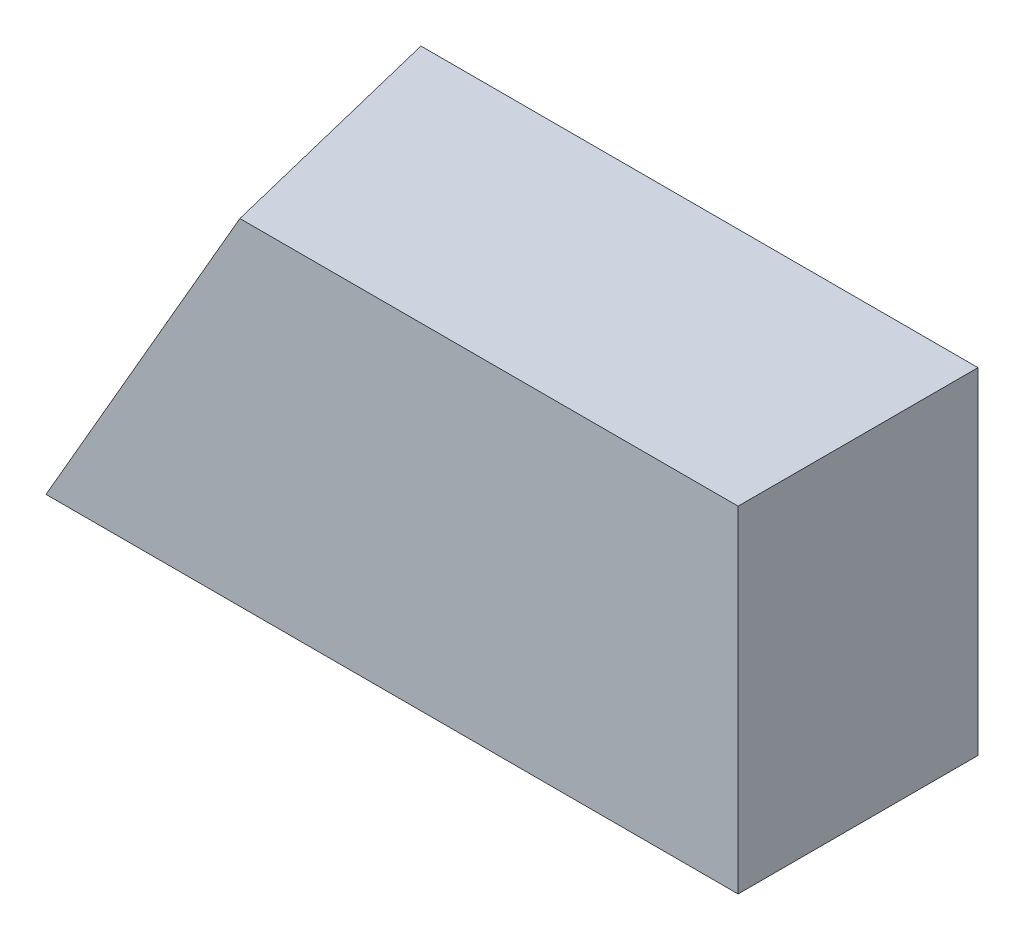
ISO-10303-21;
HEADER;
FILE_DESCRIPTION(('STEP AP214'),'2;1');
FILE_NAME('part.step','',(''),(''),'','','');
FILE_SCHEMA(('AUTOMOTIVE_DESIGN { 1 0 10303 214 1 1 1 1 }'));
ENDSEC;
DATA;
#1=APPLICATION_CONTEXT('core data for automotive mechanical design processes');
#2=APPLICATION_PROTOCOL_DEFINITION('international standard','automotive_design',2000,#1);
#3=PRODUCT_CONTEXT('',#1,'mechanical');
#4=PRODUCT('Part','Part','',(#3));
#5=PRODUCT_RELATED_PRODUCT_CATEGORY('part','',(#4));
#6=PRODUCT_DEFINITION_FORMATION('','',#4);
#7=PRODUCT_DEFINITION_CONTEXT('part definition',#1,'design');
#8=PRODUCT_DEFINITION('design','',#6,#7);
#9=PRODUCT_DEFINITION_SHAPE('','',#8);
#10=(LENGTH_UNIT() NAMED_UNIT(*) SI_UNIT(.MILLI.,.METRE.));
#11=(NAMED_UNIT(*) PLANE_ANGLE_UNIT() SI_UNIT($,.RADIAN.));
#12=(NAMED_UNIT(*) SI_UNIT($,.STERADIAN.) SOLID_ANGLE_UNIT());
#13=UNCERTAINTY_MEASURE_WITH_UNIT(LENGTH_MEASURE(1.E-05),#10,'distance_accuracy_value','');
#14=(GEOMETRIC_REPRESENTATION_CONTEXT(3) GLOBAL_UNCERTAINTY_ASSIGNED_CONTEXT((#13)) GLOBAL_UNIT_ASSIGNED_CONTEXT((#10,
#11,#12)) REPRESENTATION_CONTEXT('',''));
#15=CARTESIAN_POINT('',(0.,0.,0.));
#16=DIRECTION('',(0.,0.,1.));
#17=DIRECTION('',(1.,0.,0.));
#18=AXIS2_PLACEMENT_3D('',#15,#16,#17);
#19=CARTESIAN_POINT('',(0.,0.,0.));
#20=DIRECTION('',(0.,-1.,0.));
#21=DIRECTION('',(0.,0.,-1.));
#22=AXIS2_PLACEMENT_3D('',#19,#20,#21);
#23=PLANE('',#22);
#24=DIRECTION('',(0.,0.,-1.));
#25=VECTOR('',#24,1.);
#26=CARTESIAN_POINT('',(121.3866,0.,0.));
#27=LINE('',#26,#25);
#28=CARTESIAN_POINT('',(121.3866,0.,-6.74370000000002));
#29=VERTEX_POINT('',#28);
#30=CARTESIAN_POINT('',(121.3866,0.,-26.9748000000001));
#31=VERTEX_POINT('',#30);
#32=EDGE_CURVE('E180',#29,#31,#27,.T.);
#33=ORIENTED_EDGE('',*,*,#32,.T.);
#34=DIRECTION('',(-1.,0.,0.));
#35=VECTOR('',#34,1.);
#36=CARTESIAN_POINT('',(0.,0.,-26.9748));
#37=LINE('',#36,#35);
#38=CARTESIAN_POINT('',(74.7807055054085,0.,-26.9748000000001));
#39=VERTEX_POINT('',#38);
#40=EDGE_CURVE('E175',#31,#39,#37,.T.);
#41=ORIENTED_EDGE('',*,*,#40,.T.);
#42=DIRECTION('',(0.,0.,-1.));
#43=VECTOR('',#42,1.);
#44=CARTESIAN_POINT('',(74.7807055054085,0.,0.));
#45=LINE('',#44,#43);
#46=CARTESIAN_POINT('',(74.7807055054085,0.,-6.74370000000002));
#47=VERTEX_POINT('',#46);
#48=EDGE_CURVE('E163',#47,#39,#45,.T.);
#49=ORIENTED_EDGE('',*,*,#48,.F.);
#50=DIRECTION('',(1.,0.,0.));
#51=VECTOR('',#50,1.);
#52=CARTESIAN_POINT('',(0.,0.,-6.7437));
#53=LINE('',#52,#51);
#54=EDGE_CURVE('E171',#47,#29,#53,.T.);
#55=ORIENTED_EDGE('',*,*,#54,.T.);
#56=EDGE_LOOP('',(#33,#41,#49,#55));
#57=FACE_BOUND('',#56,.T.);
#58=DIRECTION('',(1.,0.,0.));
#59=VECTOR('',#58,1.);
#60=CARTESIAN_POINT('',(0.,0.,0.));
#61=LINE('',#60,#59);
#62=CARTESIAN_POINT('',(35.4031731808797,0.,0.));
#63=VERTEX_POINT('',#62);
#64=CARTESIAN_POINT('',(127.,0.,0.));
#65=VERTEX_POINT('',#64);
#66=EDGE_CURVE('E35',#63,#65,#61,.T.);
#67=ORIENTED_EDGE('',*,*,#66,.F.);
#68=DIRECTION('',(-0.238364575010059,0.,-0.971175745877271));
#69=VECTOR('',#68,1.);
#70=CARTESIAN_POINT('',(33.3916473481953,0.,-8.19561841698234));
#71=LINE('',#70,#69);
#72=CARTESIAN_POINT('',(27.6104793366434,0.,-31.75));
#73=VERTEX_POINT('',#72);
#74=EDGE_CURVE('E49',#63,#73,#71,.T.);
#75=ORIENTED_EDGE('',*,*,#74,.T.);
#76=DIRECTION('',(-1.,0.,0.));
#77=VECTOR('',#76,1.);
#78=CARTESIAN_POINT('',(0.,0.,-31.75));
#79=LINE('',#78,#77);
#80=CARTESIAN_POINT('',(127.,0.,-31.75));
#81=VERTEX_POINT('',#80);
#82=EDGE_CURVE('E117',#81,#73,#79,.T.);
#83=ORIENTED_EDGE('',*,*,#82,.F.);
#84=DIRECTION('',(0.,0.,-1.));
#85=VECTOR('',#84,1.);
#86=CARTESIAN_POINT('',(127.,0.,0.));
#87=LINE('',#86,#85);
#88=EDGE_CURVE('E122',#65,#81,#87,.T.);
#89=ORIENTED_EDGE('',*,*,#88,.F.);
#90=EDGE_LOOP('',(#67,#75,#83,#89));
#91=FACE_BOUND('',#90,.T.);
#92=ADVANCED_FACE('F32',(#57,#91),#23,.T.);
#93=CARTESIAN_POINT('',(0.,44.45,0.));
#94=DIRECTION('',(0.,0.,-1.));
#95=DIRECTION('',(-1.,0.,0.));
#96=AXIS2_PLACEMENT_3D('',#93,#94,#95);
#97=PLANE('',#96);
#98=DIRECTION('',(0.500000000000002,0.866025403784438,0.));
#99=VECTOR('',#98,1.);
#100=CARTESIAN_POINT('',(45.7997944847689,18.007476325389,0.));
#101=LINE('',#100,#99);
#102=CARTESIAN_POINT('',(61.0663926463587,44.45,0.));
#103=VERTEX_POINT('',#102);
#104=EDGE_CURVE('E102',#63,#103,#101,.T.);
#105=ORIENTED_EDGE('',*,*,#104,.F.);
#106=ORIENTED_EDGE('',*,*,#66,.T.);
#107=DIRECTION('',(0.,-1.,0.));
#108=VECTOR('',#107,1.);
#109=CARTESIAN_POINT('',(127.,44.45,0.));
#110=LINE('',#109,#108);
#111=CARTESIAN_POINT('',(127.,44.45,0.));
#112=VERTEX_POINT('',#111);
#113=EDGE_CURVE('E124',#112,#65,#110,.T.);
#114=ORIENTED_EDGE('',*,*,#113,.F.);
#115=DIRECTION('',(1.,0.,0.));
#116=VECTOR('',#115,1.);
#117=CARTESIAN_POINT('',(0.,44.45,0.));
#118=LINE('',#117,#116);
#119=EDGE_CURVE('E126',#103,#112,#118,.T.);
#120=ORIENTED_EDGE('',*,*,#119,.F.);
#121=EDGE_LOOP('',(#105,#106,#114,#120));
#122=FACE_BOUND('',#121,.T.);
#123=ADVANCED_FACE('F221',(#122),#97,.F.);
#124=CARTESIAN_POINT('',(0.,44.45,-31.75));
#125=DIRECTION('',(0.,0.,1.));
#126=DIRECTION('',(1.,0.,0.));
#127=AXIS2_PLACEMENT_3D('',#124,#125,#126);
#128=PLANE('',#127);
#129=DIRECTION('',(-0.500000000000002,-0.866025403784438,0.));
#130=VECTOR('',#129,1.);
#131=CARTESIAN_POINT('',(39.9552741015917,21.3818117419006,-31.75));
#132=LINE('',#131,#130);
#133=CARTESIAN_POINT('',(53.2736988021224,44.45,-31.75));
#134=VERTEX_POINT('',#133);
#135=EDGE_CURVE('E11',#134,#73,#132,.T.);
#136=ORIENTED_EDGE('',*,*,#135,.F.);
#137=DIRECTION('',(-1.,0.,0.));
#138=VECTOR('',#137,1.);
#139=CARTESIAN_POINT('',(0.,44.45,-31.75));
#140=LINE('',#139,#138);
#141=CARTESIAN_POINT('',(127.,44.45,-31.75));
#142=VERTEX_POINT('',#141);
#143=EDGE_CURVE('E115',#142,#134,#140,.T.);
#144=ORIENTED_EDGE('',*,*,#143,.F.);
#145=DIRECTION('',(0.,-1.,0.));
#146=VECTOR('',#145,1.);
#147=CARTESIAN_POINT('',(127.,44.45,-31.75));
#148=LINE('',#147,#146);
#149=EDGE_CURVE('E130',#142,#81,#148,.T.);
#150=ORIENTED_EDGE('',*,*,#149,.T.);
#151=ORIENTED_EDGE('',*,*,#82,.T.);
#152=EDGE_LOOP('',(#136,#144,#150,#151));
#153=FACE_BOUND('',#152,.T.);
#154=ADVANCED_FACE('F113',(#153),#128,.F.);
#155=CARTESIAN_POINT('',(0.,44.45,0.));
#156=DIRECTION('',(0.,-1.,0.));
#157=DIRECTION('',(0.,0.,-1.));
#158=AXIS2_PLACEMENT_3D('',#155,#156,#157);
#159=PLANE('',#158);
#160=DIRECTION('',(-0.238364575010059,0.,-0.971175745877271));
#161=VECTOR('',#160,1.);
#162=CARTESIAN_POINT('',(57.596742463043,44.45,-14.1364970217265));
#163=LINE('',#162,#161);
#164=EDGE_CURVE('E41',#103,#134,#163,.T.);
#165=ORIENTED_EDGE('',*,*,#164,.F.);
#166=ORIENTED_EDGE('',*,*,#119,.T.);
#167=DIRECTION('',(0.,0.,-1.));
#168=VECTOR('',#167,1.);
#169=CARTESIAN_POINT('',(127.,44.45,0.));
#170=LINE('',#169,#168);
#171=EDGE_CURVE('E120',#112,#142,#170,.T.);
#172=ORIENTED_EDGE('',*,*,#171,.T.);
#173=ORIENTED_EDGE('',*,*,#143,.T.);
#174=EDGE_LOOP('',(#165,#166,#172,#173));
#175=FACE_BOUND('',#174,.T.);
#176=ADVANCED_FACE('F118',(#175),#159,.F.);
#177=CARTESIAN_POINT('',(127.,44.45,0.));
#178=DIRECTION('',(-1.,0.,0.));
#179=DIRECTION('',(0.,0.,1.));
#180=AXIS2_PLACEMENT_3D('',#177,#178,#179);
#181=PLANE('',#180);
#182=ORIENTED_EDGE('',*,*,#88,.T.);
#183=ORIENTED_EDGE('',*,*,#149,.F.);
#184=ORIENTED_EDGE('',*,*,#171,.F.);
#185=ORIENTED_EDGE('',*,*,#113,.T.);
#186=EDGE_LOOP('',(#182,#183,#184,#185));
#187=FACE_BOUND('',#186,.T.);
#188=ADVANCED_FACE('F232',(#187),#181,.F.);
#189=CARTESIAN_POINT('',(121.3866,40.4622,157.553779196041));
#190=DIRECTION('',(-1.,0.,0.));
#191=DIRECTION('',(0.,0.,1.));
#192=AXIS2_PLACEMENT_3D('',#189,#190,#191);
#193=PLANE('',#192);
#194=DIRECTION('',(0.,-1.,0.));
#195=VECTOR('',#194,1.);
#196=CARTESIAN_POINT('',(121.3866,40.4622,-6.74370000000002));
#197=LINE('',#196,#195);
#198=CARTESIAN_POINT('',(121.3866,35.06724,-6.74370000000002));
#199=VERTEX_POINT('',#198);
#200=EDGE_CURVE('E161',#199,#29,#197,.T.);
#201=ORIENTED_EDGE('',*,*,#200,.F.);
#202=DIRECTION('',(0.,0.,-1.));
#203=VECTOR('',#202,1.);
#204=CARTESIAN_POINT('',(121.3866,35.06724,36.1671791960408));
#205=LINE('',#204,#203);
#206=CARTESIAN_POINT('',(121.3866,35.06724,-26.9748000000001));
#207=VERTEX_POINT('',#206);
#208=EDGE_CURVE('E149',#207,#199,#205,.F.);
#209=ORIENTED_EDGE('',*,*,#208,.F.);
#210=DIRECTION('',(0.,1.,0.));
#211=VECTOR('',#210,1.);
#212=CARTESIAN_POINT('',(121.3866,40.4622,-26.9748000000001));
#213=LINE('',#212,#211);
#214=EDGE_CURVE('E138',#31,#207,#213,.T.);
#215=ORIENTED_EDGE('',*,*,#214,.F.);
#216=ORIENTED_EDGE('',*,*,#32,.F.);
#217=EDGE_LOOP('',(#201,#209,#215,#216));
#218=FACE_BOUND('',#217,.T.);
#219=ADVANCED_FACE('F187',(#218),#193,.T.);
#220=CARTESIAN_POINT('',(121.3866,40.4622,157.553779196041));
#221=DIRECTION('',(0.,1.,0.));
#222=DIRECTION('',(0.,0.,1.));
#223=AXIS2_PLACEMENT_3D('',#220,#221,#222);
#224=PLANE('',#223);
#225=DIRECTION('',(-1.,0.,0.));
#226=VECTOR('',#225,1.);
#227=CARTESIAN_POINT('',(138.920219997163,40.4622,-6.74370000000002));
#228=LINE('',#227,#226);
#229=CARTESIAN_POINT('',(115.99164,40.4622,-6.74370000000002));
#230=VERTEX_POINT('',#229);
#231=CARTESIAN_POINT('',(99.80676,40.4622,-6.74370000000002));
#232=VERTEX_POINT('',#231);
#233=EDGE_CURVE('E157',#230,#232,#228,.T.);
#234=ORIENTED_EDGE('',*,*,#233,.T.);
#235=DIRECTION('',(0.,0.,1.));
#236=VECTOR('',#235,1.);
#237=CARTESIAN_POINT('',(99.80676,40.4622,157.553779196041));
#238=LINE('',#237,#236);
#239=CARTESIAN_POINT('',(99.80676,40.4622,-26.9748000000001));
#240=VERTEX_POINT('',#239);
#241=EDGE_CURVE('E140',#240,#232,#238,.T.);
#242=ORIENTED_EDGE('',*,*,#241,.F.);
#243=DIRECTION('',(1.,0.,0.));
#244=VECTOR('',#243,1.);
#245=CARTESIAN_POINT('',(121.3866,40.4622,-26.9748000000001));
#246=LINE('',#245,#244);
#247=CARTESIAN_POINT('',(115.99164,40.4622,-26.9748000000001));
#248=VERTEX_POINT('',#247);
#249=EDGE_CURVE('E154',#240,#248,#246,.T.);
#250=ORIENTED_EDGE('',*,*,#249,.T.);
#251=DIRECTION('',(0.,0.,-1.));
#252=VECTOR('',#251,1.);
#253=CARTESIAN_POINT('',(115.99164,40.4622,-58.2446208039592));
#254=LINE('',#253,#252);
#255=EDGE_CURVE('E145',#230,#248,#254,.T.);
#256=ORIENTED_EDGE('',*,*,#255,.F.);
#257=EDGE_LOOP('',(#234,#242,#250,#256));
#258=FACE_BOUND('',#257,.T.);
#259=ADVANCED_FACE('F201',(#258),#224,.F.);
#260=CARTESIAN_POINT('',(115.99164,35.06724,157.553779196041));
#261=DIRECTION('',(0.,0.,1.));
#262=DIRECTION('',(1.,0.,0.));
#263=AXIS2_PLACEMENT_3D('',#260,#261,#262);
#264=CYLINDRICAL_SURFACE('',#263,5.39496);
#265=CARTESIAN_POINT('',(115.99164,35.06724,-6.74370000000002));
#266=DIRECTION('',(0.,0.,-1.));
#267=DIRECTION('',(-1.,0.,0.));
#268=AXIS2_PLACEMENT_3D('',#265,#266,#267);
#269=CIRCLE('',#268,5.39496);
#270=EDGE_CURVE('E148',#199,#230,#269,.F.);
#271=ORIENTED_EDGE('',*,*,#270,.T.);
#272=ORIENTED_EDGE('',*,*,#255,.T.);
#273=CARTESIAN_POINT('',(115.99164,35.06724,-26.9748000000001));
#274=DIRECTION('',(0.,0.,1.));
#275=DIRECTION('',(1.,0.,0.));
#276=AXIS2_PLACEMENT_3D('',#273,#274,#275);
#277=CIRCLE('',#276,5.39496);
#278=EDGE_CURVE('E147',#248,#207,#277,.F.);
#279=ORIENTED_EDGE('',*,*,#278,.T.);
#280=ORIENTED_EDGE('',*,*,#208,.T.);
#281=EDGE_LOOP('',(#271,#272,#279,#280));
#282=FACE_BOUND('',#281,.T.);
#283=ADVANCED_FACE('F196',(#282),#264,.F.);
#284=CARTESIAN_POINT('',(99.80676,35.06724,157.553779196041));
#285=DIRECTION('',(0.,0.,-1.));
#286=DIRECTION('',(-1.,0.,0.));
#287=AXIS2_PLACEMENT_3D('',#284,#285,#286);
#288=CYLINDRICAL_SURFACE('',#287,5.39496);
#289=DIRECTION('',(0.,0.,-1.));
#290=VECTOR('',#289,1.);
#291=CARTESIAN_POINT('',(97.951626249292,40.1332119865574,157.553779196041));
#292=LINE('',#291,#290);
#293=CARTESIAN_POINT('',(97.951626249292,40.1332119865574,-6.74370000000002));
#294=VERTEX_POINT('',#293);
#295=CARTESIAN_POINT('',(97.951626249292,40.1332119865574,-26.9748000000001));
#296=VERTEX_POINT('',#295);
#297=EDGE_CURVE('E152',#294,#296,#292,.T.);
#298=ORIENTED_EDGE('',*,*,#297,.T.);
#299=CARTESIAN_POINT('',(99.80676,35.06724,-26.9748000000001));
#300=DIRECTION('',(0.,0.,1.));
#301=DIRECTION('',(1.,0.,0.));
#302=AXIS2_PLACEMENT_3D('',#299,#300,#301);
#303=CIRCLE('',#302,5.39496);
#304=EDGE_CURVE('E144',#296,#240,#303,.F.);
#305=ORIENTED_EDGE('',*,*,#304,.T.);
#306=ORIENTED_EDGE('',*,*,#241,.T.);
#307=CARTESIAN_POINT('',(99.80676,35.06724,-6.74370000000002));
#308=DIRECTION('',(0.,0.,-1.));
#309=DIRECTION('',(-1.,0.,0.));
#310=AXIS2_PLACEMENT_3D('',#307,#308,#309);
#311=CIRCLE('',#310,5.39496);
#312=EDGE_CURVE('E143',#232,#294,#311,.F.);
#313=ORIENTED_EDGE('',*,*,#312,.T.);
#314=EDGE_LOOP('',(#298,#305,#306,#313));
#315=FACE_BOUND('',#314,.T.);
#316=ADVANCED_FACE('F204',(#315),#288,.F.);
#317=CARTESIAN_POINT('',(95.026785959146,35.06724,157.553779196041));
#318=DIRECTION('',(-0.866025403784435,0.500000000000006,0.));
#319=DIRECTION('',(0.,0.,-1.));
#320=AXIS2_PLACEMENT_3D('',#317,#318,#319);
#321=PLANE('',#320);
#322=ORIENTED_EDGE('',*,*,#48,.T.);
#323=DIRECTION('',(0.500000000000006,0.866025403784435,0.));
#324=VECTOR('',#323,1.);
#325=CARTESIAN_POINT('',(95.026785959146,35.06724,-26.9748000000001));
#326=LINE('',#325,#324);
#327=EDGE_CURVE('E139',#39,#296,#326,.T.);
#328=ORIENTED_EDGE('',*,*,#327,.T.);
#329=ORIENTED_EDGE('',*,*,#297,.F.);
#330=DIRECTION('',(-0.500000000000006,-0.866025403784435,0.));
#331=VECTOR('',#330,1.);
#332=CARTESIAN_POINT('',(95.026785959146,35.06724,-6.74370000000002));
#333=LINE('',#332,#331);
#334=EDGE_CURVE('E135',#294,#47,#333,.T.);
#335=ORIENTED_EDGE('',*,*,#334,.T.);
#336=EDGE_LOOP('',(#322,#328,#329,#335));
#337=FACE_BOUND('',#336,.T.);
#338=ADVANCED_FACE('F208',(#337),#321,.F.);
#339=CARTESIAN_POINT('',(192.869819997163,-121.3866,-26.9748000000001));
#340=DIRECTION('',(0.,0.,1.));
#341=DIRECTION('',(1.,0.,0.));
#342=AXIS2_PLACEMENT_3D('',#339,#340,#341);
#343=PLANE('',#342);
#344=ORIENTED_EDGE('',*,*,#214,.T.);
#345=ORIENTED_EDGE('',*,*,#278,.F.);
#346=ORIENTED_EDGE('',*,*,#249,.F.);
#347=ORIENTED_EDGE('',*,*,#304,.F.);
#348=ORIENTED_EDGE('',*,*,#327,.F.);
#349=ORIENTED_EDGE('',*,*,#40,.F.);
#350=EDGE_LOOP('',(#344,#345,#346,#347,#348,#349));
#351=FACE_BOUND('',#350,.T.);
#352=ADVANCED_FACE('F192',(#351),#343,.T.);
#353=CARTESIAN_POINT('',(138.920219997163,-107.8992,-6.74370000000002));
#354=DIRECTION('',(0.,0.,-1.));
#355=DIRECTION('',(-1.,0.,0.));
#356=AXIS2_PLACEMENT_3D('',#353,#354,#355);
#357=PLANE('',#356);
#358=ORIENTED_EDGE('',*,*,#334,.F.);
#359=ORIENTED_EDGE('',*,*,#312,.F.);
#360=ORIENTED_EDGE('',*,*,#233,.F.);
#361=ORIENTED_EDGE('',*,*,#270,.F.);
#362=ORIENTED_EDGE('',*,*,#200,.T.);
#363=ORIENTED_EDGE('',*,*,#54,.F.);
#364=EDGE_LOOP('',(#358,#359,#360,#361,#362,#363));
#365=FACE_BOUND('',#364,.T.);
#366=ADVANCED_FACE('F210',(#365),#357,.T.);
#367=CARTESIAN_POINT('',(12.3412443057371,-8.1583830287696,-74.7708027778095));
#368=DIRECTION('',(-0.847100670886273,0.489073800366905,0.207911690817759));
#369=DIRECTION('',(-0.00181201974993757,-0.393884673544342,0.919158082448984));
#370=AXIS2_PLACEMENT_3D('',#367,#368,#369);
#371=PLANE('',#370);
#372=ORIENTED_EDGE('',*,*,#104,.T.);
#373=ORIENTED_EDGE('',*,*,#164,.T.);
#374=ORIENTED_EDGE('',*,*,#135,.T.);
#375=ORIENTED_EDGE('',*,*,#74,.F.);
#376=EDGE_LOOP('',(#372,#373,#374,#375));
#377=FACE_BOUND('',#376,.T.);
#378=ADVANCED_FACE('F105',(#377),#371,.T.);
#379=CLOSED_SHELL('',(#92,#123,#154,#176,#188,#219,#259,#283,#316,#338,#352,#366,#378));
#380=MANIFOLD_SOLID_BREP('B2',#379);
#381=ADVANCED_BREP_SHAPE_REPRESENTATION('',(#18,#380),#14);
#382=SHAPE_DEFINITION_REPRESENTATION(#9,#381);
ENDSEC;
END-ISO-10303-21;
